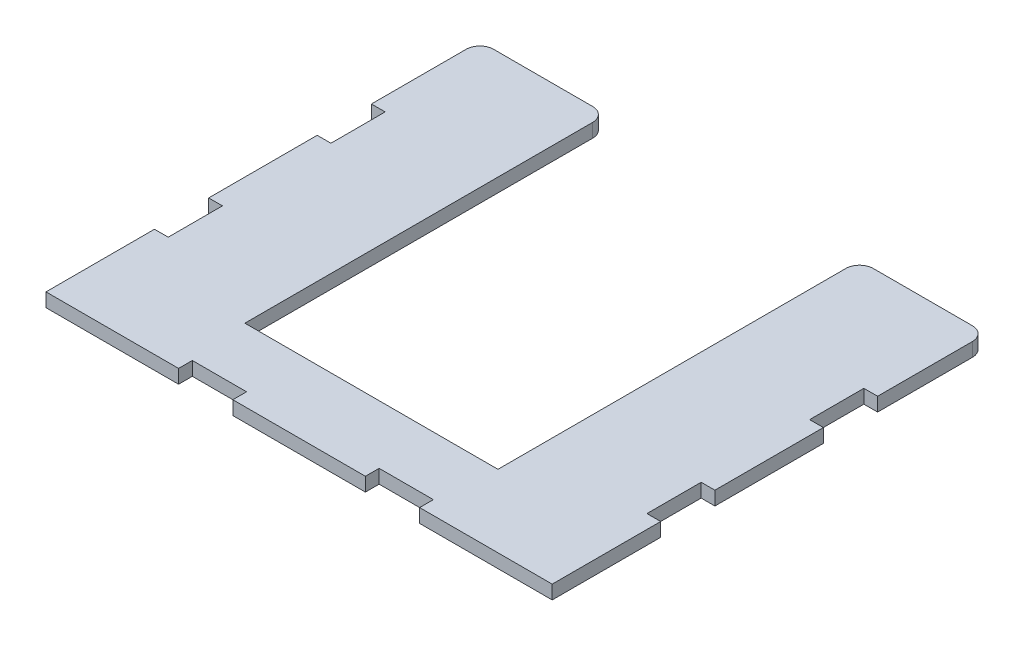
ISO-10303-21;
HEADER;
FILE_DESCRIPTION(('STEP AP214'),'2;1');
FILE_NAME('part.step','',(''),(''),'','','');
FILE_SCHEMA(('AUTOMOTIVE_DESIGN { 1 0 10303 214 1 1 1 1 }'));
ENDSEC;
DATA;
#1=APPLICATION_CONTEXT('core data for automotive mechanical design processes');
#2=APPLICATION_PROTOCOL_DEFINITION('international standard','automotive_design',2000,#1);
#3=PRODUCT_CONTEXT('',#1,'mechanical');
#4=PRODUCT('Part','Part','',(#3));
#5=PRODUCT_RELATED_PRODUCT_CATEGORY('part','',(#4));
#6=PRODUCT_DEFINITION_FORMATION('','',#4);
#7=PRODUCT_DEFINITION_CONTEXT('part definition',#1,'design');
#8=PRODUCT_DEFINITION('design','',#6,#7);
#9=PRODUCT_DEFINITION_SHAPE('','',#8);
#10=(LENGTH_UNIT() NAMED_UNIT(*) SI_UNIT(.MILLI.,.METRE.));
#11=(NAMED_UNIT(*) PLANE_ANGLE_UNIT() SI_UNIT($,.RADIAN.));
#12=(NAMED_UNIT(*) SI_UNIT($,.STERADIAN.) SOLID_ANGLE_UNIT());
#13=UNCERTAINTY_MEASURE_WITH_UNIT(LENGTH_MEASURE(1.E-05),#10,'distance_accuracy_value','');
#14=(GEOMETRIC_REPRESENTATION_CONTEXT(3) GLOBAL_UNCERTAINTY_ASSIGNED_CONTEXT((#13)) GLOBAL_UNIT_ASSIGNED_CONTEXT((#10,
#11,#12)) REPRESENTATION_CONTEXT('',''));
#15=CARTESIAN_POINT('',(0.,0.,0.));
#16=DIRECTION('',(0.,0.,1.));
#17=DIRECTION('',(1.,0.,0.));
#18=AXIS2_PLACEMENT_3D('',#15,#16,#17);
#19=CARTESIAN_POINT('',(177.8,4.826,0.));
#20=DIRECTION('',(-1.,0.,0.));
#21=DIRECTION('',(0.,0.,1.));
#22=AXIS2_PLACEMENT_3D('',#19,#20,#21);
#23=PLANE('',#22);
#24=DIRECTION('',(0.,0.,-1.));
#25=VECTOR('',#24,1.);
#26=CARTESIAN_POINT('',(177.8,0.,0.));
#27=LINE('',#26,#25);
#28=CARTESIAN_POINT('',(177.8,0.,0.));
#29=VERTEX_POINT('',#28);
#30=CARTESIAN_POINT('',(177.8,0.,-38.1));
#31=VERTEX_POINT('',#30);
#32=EDGE_CURVE('E296',#29,#31,#27,.T.);
#33=ORIENTED_EDGE('',*,*,#32,.T.);
#34=DIRECTION('',(0.,1.,0.));
#35=VECTOR('',#34,1.);
#36=CARTESIAN_POINT('',(177.8,0.,-38.1));
#37=LINE('',#36,#35);
#38=CARTESIAN_POINT('',(177.8,4.826,-38.1));
#39=VERTEX_POINT('',#38);
#40=EDGE_CURVE('E918',#31,#39,#37,.T.);
#41=ORIENTED_EDGE('',*,*,#40,.T.);
#42=DIRECTION('',(0.,0.,-1.));
#43=VECTOR('',#42,1.);
#44=CARTESIAN_POINT('',(177.8,4.826,0.));
#45=LINE('',#44,#43);
#46=CARTESIAN_POINT('',(177.8,4.826,0.));
#47=VERTEX_POINT('',#46);
#48=EDGE_CURVE('E385',#47,#39,#45,.T.);
#49=ORIENTED_EDGE('',*,*,#48,.F.);
#50=DIRECTION('',(0.,-1.,0.));
#51=VECTOR('',#50,1.);
#52=CARTESIAN_POINT('',(177.8,4.826,0.));
#53=LINE('',#52,#51);
#54=EDGE_CURVE('E310',#47,#29,#53,.T.);
#55=ORIENTED_EDGE('',*,*,#54,.T.);
#56=EDGE_LOOP('',(#33,#41,#49,#55));
#57=FACE_BOUND('',#56,.T.);
#58=ADVANCED_FACE('F34',(#57),#23,.F.);
#59=CARTESIAN_POINT('',(177.8,4.826,-57.15));
#60=VERTEX_POINT('',#59);
#61=CARTESIAN_POINT('',(177.8,4.826,-95.25));
#62=VERTEX_POINT('',#61);
#63=EDGE_CURVE('E287',#60,#62,#45,.T.);
#64=ORIENTED_EDGE('',*,*,#63,.F.);
#65=DIRECTION('',(0.,1.,0.));
#66=VECTOR('',#65,1.);
#67=CARTESIAN_POINT('',(177.8,0.,-57.15));
#68=LINE('',#67,#66);
#69=CARTESIAN_POINT('',(177.8,0.,-57.15));
#70=VERTEX_POINT('',#69);
#71=EDGE_CURVE('E272',#70,#60,#68,.T.);
#72=ORIENTED_EDGE('',*,*,#71,.F.);
#73=CARTESIAN_POINT('',(177.8,0.,-95.25));
#74=VERTEX_POINT('',#73);
#75=EDGE_CURVE('E285',#70,#74,#27,.T.);
#76=ORIENTED_EDGE('',*,*,#75,.T.);
#77=DIRECTION('',(0.,1.,0.));
#78=VECTOR('',#77,1.);
#79=CARTESIAN_POINT('',(177.8,0.,-95.25));
#80=LINE('',#79,#78);
#81=EDGE_CURVE('E562',#74,#62,#80,.T.);
#82=ORIENTED_EDGE('',*,*,#81,.T.);
#83=EDGE_LOOP('',(#64,#72,#76,#82));
#84=FACE_BOUND('',#83,.T.);
#85=ADVANCED_FACE('F283',(#84),#23,.F.);
#86=CARTESIAN_POINT('',(0.,4.826,0.));
#87=DIRECTION('',(1.,0.,0.));
#88=DIRECTION('',(0.,0.,-1.));
#89=AXIS2_PLACEMENT_3D('',#86,#87,#88);
#90=PLANE('',#89);
#91=DIRECTION('',(0.,0.,1.));
#92=VECTOR('',#91,1.);
#93=CARTESIAN_POINT('',(0.,0.,0.));
#94=LINE('',#93,#92);
#95=CARTESIAN_POINT('',(0.,0.,-95.25));
#96=VERTEX_POINT('',#95);
#97=CARTESIAN_POINT('',(0.,0.,-57.15));
#98=VERTEX_POINT('',#97);
#99=EDGE_CURVE('E391',#96,#98,#94,.T.);
#100=ORIENTED_EDGE('',*,*,#99,.T.);
#101=DIRECTION('',(0.,1.,0.));
#102=VECTOR('',#101,1.);
#103=CARTESIAN_POINT('',(0.,0.,-57.15));
#104=LINE('',#103,#102);
#105=CARTESIAN_POINT('',(0.,4.826,-57.15));
#106=VERTEX_POINT('',#105);
#107=EDGE_CURVE('E437',#98,#106,#104,.T.);
#108=ORIENTED_EDGE('',*,*,#107,.T.);
#109=DIRECTION('',(0.,0.,1.));
#110=VECTOR('',#109,1.);
#111=CARTESIAN_POINT('',(0.,4.826,0.));
#112=LINE('',#111,#110);
#113=CARTESIAN_POINT('',(0.,4.826,-95.25));
#114=VERTEX_POINT('',#113);
#115=EDGE_CURVE('E379',#114,#106,#112,.T.);
#116=ORIENTED_EDGE('',*,*,#115,.F.);
#117=DIRECTION('',(0.,1.,0.));
#118=VECTOR('',#117,1.);
#119=CARTESIAN_POINT('',(0.,0.,-95.25));
#120=LINE('',#119,#118);
#121=EDGE_CURVE('E435',#96,#114,#120,.T.);
#122=ORIENTED_EDGE('',*,*,#121,.F.);
#123=EDGE_LOOP('',(#100,#108,#116,#122));
#124=FACE_BOUND('',#123,.T.);
#125=ADVANCED_FACE('F434',(#124),#90,.F.);
#126=CARTESIAN_POINT('',(0.,4.826,-147.574));
#127=VERTEX_POINT('',#126);
#128=CARTESIAN_POINT('',(0.,4.826,-114.3));
#129=VERTEX_POINT('',#128);
#130=EDGE_CURVE('E376',#127,#129,#112,.T.);
#131=ORIENTED_EDGE('',*,*,#130,.F.);
#132=DIRECTION('',(0.,-1.,0.));
#133=VECTOR('',#132,1.);
#134=CARTESIAN_POINT('',(0.,4.826,-147.574));
#135=LINE('',#134,#133);
#136=CARTESIAN_POINT('',(0.,0.,-147.574));
#137=VERTEX_POINT('',#136);
#138=EDGE_CURVE('E317',#127,#137,#135,.T.);
#139=ORIENTED_EDGE('',*,*,#138,.T.);
#140=CARTESIAN_POINT('',(0.,0.,-114.3));
#141=VERTEX_POINT('',#140);
#142=EDGE_CURVE('E389',#137,#141,#94,.T.);
#143=ORIENTED_EDGE('',*,*,#142,.T.);
#144=DIRECTION('',(0.,1.,0.));
#145=VECTOR('',#144,1.);
#146=CARTESIAN_POINT('',(0.,0.,-114.3));
#147=LINE('',#146,#145);
#148=EDGE_CURVE('E467',#141,#129,#147,.T.);
#149=ORIENTED_EDGE('',*,*,#148,.T.);
#150=EDGE_LOOP('',(#131,#139,#143,#149));
#151=FACE_BOUND('',#150,.T.);
#152=ADVANCED_FACE('F603',(#151),#90,.F.);
#153=CARTESIAN_POINT('',(0.,4.826,0.));
#154=DIRECTION('',(0.,0.,-1.));
#155=DIRECTION('',(-1.,0.,0.));
#156=AXIS2_PLACEMENT_3D('',#153,#154,#155);
#157=PLANE('',#156);
#158=DIRECTION('',(1.,0.,0.));
#159=VECTOR('',#158,1.);
#160=CARTESIAN_POINT('',(0.,0.,0.));
#161=LINE('',#160,#159);
#162=CARTESIAN_POINT('',(65.6166666666667,0.,0.));
#163=VERTEX_POINT('',#162);
#164=CARTESIAN_POINT('',(112.183333333333,0.,0.));
#165=VERTEX_POINT('',#164);
#166=EDGE_CURVE('E395',#163,#165,#161,.T.);
#167=ORIENTED_EDGE('',*,*,#166,.T.);
#168=DIRECTION('',(0.,1.,0.));
#169=VECTOR('',#168,1.);
#170=CARTESIAN_POINT('',(112.183333333333,0.,0.));
#171=LINE('',#170,#169);
#172=CARTESIAN_POINT('',(112.183333333333,4.826,0.));
#173=VERTEX_POINT('',#172);
#174=EDGE_CURVE('E485',#165,#173,#171,.T.);
#175=ORIENTED_EDGE('',*,*,#174,.T.);
#176=DIRECTION('',(1.,0.,0.));
#177=VECTOR('',#176,1.);
#178=CARTESIAN_POINT('',(0.,4.826,0.));
#179=LINE('',#178,#177);
#180=CARTESIAN_POINT('',(65.6166666666667,4.826,0.));
#181=VERTEX_POINT('',#180);
#182=EDGE_CURVE('E384',#181,#173,#179,.T.);
#183=ORIENTED_EDGE('',*,*,#182,.F.);
#184=DIRECTION('',(0.,1.,0.));
#185=VECTOR('',#184,1.);
#186=CARTESIAN_POINT('',(65.6166666666667,0.,0.));
#187=LINE('',#186,#185);
#188=EDGE_CURVE('E514',#163,#181,#187,.T.);
#189=ORIENTED_EDGE('',*,*,#188,.F.);
#190=EDGE_LOOP('',(#167,#175,#183,#189));
#191=FACE_BOUND('',#190,.T.);
#192=ADVANCED_FACE('F598',(#191),#157,.F.);
#193=CARTESIAN_POINT('',(0.,0.,0.));
#194=VERTEX_POINT('',#193);
#195=CARTESIAN_POINT('',(46.5666666666667,0.,0.));
#196=VERTEX_POINT('',#195);
#197=EDGE_CURVE('E302',#194,#196,#161,.T.);
#198=ORIENTED_EDGE('',*,*,#197,.T.);
#199=DIRECTION('',(0.,1.,0.));
#200=VECTOR('',#199,1.);
#201=CARTESIAN_POINT('',(46.5666666666667,0.,0.));
#202=LINE('',#201,#200);
#203=CARTESIAN_POINT('',(46.5666666666667,4.826,0.));
#204=VERTEX_POINT('',#203);
#205=EDGE_CURVE('E415',#196,#204,#202,.T.);
#206=ORIENTED_EDGE('',*,*,#205,.T.);
#207=CARTESIAN_POINT('',(0.,4.826,0.));
#208=VERTEX_POINT('',#207);
#209=EDGE_CURVE('E380',#208,#204,#179,.T.);
#210=ORIENTED_EDGE('',*,*,#209,.F.);
#211=DIRECTION('',(0.,-1.,0.));
#212=VECTOR('',#211,1.);
#213=CARTESIAN_POINT('',(0.,4.826,0.));
#214=LINE('',#213,#212);
#215=EDGE_CURVE('E313',#208,#194,#214,.T.);
#216=ORIENTED_EDGE('',*,*,#215,.T.);
#217=EDGE_LOOP('',(#198,#206,#210,#216));
#218=FACE_BOUND('',#217,.T.);
#219=ADVANCED_FACE('F414',(#218),#157,.F.);
#220=CARTESIAN_POINT('',(0.,4.826,-152.4));
#221=DIRECTION('',(0.,0.,1.));
#222=DIRECTION('',(1.,0.,0.));
#223=AXIS2_PLACEMENT_3D('',#220,#221,#222);
#224=PLANE('',#223);
#225=DIRECTION('',(-1.,0.,0.));
#226=VECTOR('',#225,1.);
#227=CARTESIAN_POINT('',(0.,0.,-152.4));
#228=LINE('',#227,#226);
#229=CARTESIAN_POINT('',(39.624,0.,-152.4));
#230=VERTEX_POINT('',#229);
#231=CARTESIAN_POINT('',(4.826,0.,-152.4));
#232=VERTEX_POINT('',#231);
#233=EDGE_CURVE('E300',#230,#232,#228,.T.);
#234=ORIENTED_EDGE('',*,*,#233,.T.);
#235=DIRECTION('',(0.,-1.,0.));
#236=VECTOR('',#235,1.);
#237=CARTESIAN_POINT('',(4.826,4.826,-152.4));
#238=LINE('',#237,#236);
#239=CARTESIAN_POINT('',(4.826,4.826,-152.4));
#240=VERTEX_POINT('',#239);
#241=EDGE_CURVE('E330',#232,#240,#238,.F.);
#242=ORIENTED_EDGE('',*,*,#241,.T.);
#243=DIRECTION('',(-1.,0.,0.));
#244=VECTOR('',#243,1.);
#245=CARTESIAN_POINT('',(0.,4.826,-152.4));
#246=LINE('',#245,#244);
#247=CARTESIAN_POINT('',(39.624,4.826,-152.4));
#248=VERTEX_POINT('',#247);
#249=EDGE_CURVE('E388',#248,#240,#246,.T.);
#250=ORIENTED_EDGE('',*,*,#249,.F.);
#251=DIRECTION('',(0.,1.,0.));
#252=VECTOR('',#251,1.);
#253=CARTESIAN_POINT('',(39.624,4.826,-152.4));
#254=LINE('',#253,#252);
#255=EDGE_CURVE('E328',#248,#230,#254,.F.);
#256=ORIENTED_EDGE('',*,*,#255,.T.);
#257=EDGE_LOOP('',(#234,#242,#250,#256));
#258=FACE_BOUND('',#257,.T.);
#259=ADVANCED_FACE('F596',(#258),#224,.F.);
#260=CARTESIAN_POINT('',(0.,4.826,-38.1));
#261=VERTEX_POINT('',#260);
#262=EDGE_CURVE('E309',#261,#208,#112,.T.);
#263=ORIENTED_EDGE('',*,*,#262,.F.);
#264=DIRECTION('',(0.,1.,0.));
#265=VECTOR('',#264,1.);
#266=CARTESIAN_POINT('',(0.,0.,-38.1));
#267=LINE('',#266,#265);
#268=CARTESIAN_POINT('',(0.,0.,-38.1));
#269=VERTEX_POINT('',#268);
#270=EDGE_CURVE('E404',#269,#261,#267,.T.);
#271=ORIENTED_EDGE('',*,*,#270,.F.);
#272=EDGE_CURVE('E373',#269,#194,#94,.T.);
#273=ORIENTED_EDGE('',*,*,#272,.T.);
#274=ORIENTED_EDGE('',*,*,#215,.F.);
#275=EDGE_LOOP('',(#263,#271,#273,#274));
#276=FACE_BOUND('',#275,.T.);
#277=ADVANCED_FACE('F403',(#276),#90,.F.);
#278=CARTESIAN_POINT('',(131.233333333333,4.826,0.));
#279=VERTEX_POINT('',#278);
#280=EDGE_CURVE('E378',#279,#47,#179,.T.);
#281=ORIENTED_EDGE('',*,*,#280,.F.);
#282=DIRECTION('',(0.,1.,0.));
#283=VECTOR('',#282,1.);
#284=CARTESIAN_POINT('',(131.233333333333,0.,0.));
#285=LINE('',#284,#283);
#286=CARTESIAN_POINT('',(131.233333333333,0.,0.));
#287=VERTEX_POINT('',#286);
#288=EDGE_CURVE('E496',#287,#279,#285,.T.);
#289=ORIENTED_EDGE('',*,*,#288,.F.);
#290=EDGE_CURVE('E390',#287,#29,#161,.T.);
#291=ORIENTED_EDGE('',*,*,#290,.T.);
#292=ORIENTED_EDGE('',*,*,#54,.F.);
#293=EDGE_LOOP('',(#281,#289,#291,#292));
#294=FACE_BOUND('',#293,.T.);
#295=ADVANCED_FACE('F591',(#294),#157,.F.);
#296=CARTESIAN_POINT('',(177.8,0.,-114.3));
#297=VERTEX_POINT('',#296);
#298=CARTESIAN_POINT('',(177.8,0.,-147.574));
#299=VERTEX_POINT('',#298);
#300=EDGE_CURVE('E297',#297,#299,#27,.T.);
#301=ORIENTED_EDGE('',*,*,#300,.T.);
#302=DIRECTION('',(0.,-1.,0.));
#303=VECTOR('',#302,1.);
#304=CARTESIAN_POINT('',(177.8,4.826,-147.574));
#305=LINE('',#304,#303);
#306=CARTESIAN_POINT('',(177.8,4.826,-147.574));
#307=VERTEX_POINT('',#306);
#308=EDGE_CURVE('E344',#299,#307,#305,.F.);
#309=ORIENTED_EDGE('',*,*,#308,.T.);
#310=CARTESIAN_POINT('',(177.8,4.826,-114.3));
#311=VERTEX_POINT('',#310);
#312=EDGE_CURVE('E383',#311,#307,#45,.T.);
#313=ORIENTED_EDGE('',*,*,#312,.F.);
#314=DIRECTION('',(0.,1.,0.));
#315=VECTOR('',#314,1.);
#316=CARTESIAN_POINT('',(177.8,0.,-114.3));
#317=LINE('',#316,#315);
#318=EDGE_CURVE('E544',#297,#311,#317,.T.);
#319=ORIENTED_EDGE('',*,*,#318,.F.);
#320=EDGE_LOOP('',(#301,#309,#313,#319));
#321=FACE_BOUND('',#320,.T.);
#322=ADVANCED_FACE('F543',(#321),#23,.F.);
#323=CARTESIAN_POINT('',(172.974,4.826,-152.4));
#324=VERTEX_POINT('',#323);
#325=CARTESIAN_POINT('',(138.176,4.826,-152.4));
#326=VERTEX_POINT('',#325);
#327=EDGE_CURVE('E314',#324,#326,#246,.T.);
#328=ORIENTED_EDGE('',*,*,#327,.F.);
#329=DIRECTION('',(0.,-1.,0.));
#330=VECTOR('',#329,1.);
#331=CARTESIAN_POINT('',(172.974,4.826,-152.4));
#332=LINE('',#331,#330);
#333=CARTESIAN_POINT('',(172.974,0.,-152.4));
#334=VERTEX_POINT('',#333);
#335=EDGE_CURVE('E341',#324,#334,#332,.T.);
#336=ORIENTED_EDGE('',*,*,#335,.T.);
#337=CARTESIAN_POINT('',(138.176,0.,-152.4));
#338=VERTEX_POINT('',#337);
#339=EDGE_CURVE('E306',#334,#338,#228,.T.);
#340=ORIENTED_EDGE('',*,*,#339,.T.);
#341=DIRECTION('',(0.,1.,0.));
#342=VECTOR('',#341,1.);
#343=CARTESIAN_POINT('',(138.176,4.826,-152.4));
#344=LINE('',#343,#342);
#345=EDGE_CURVE('E338',#338,#326,#344,.T.);
#346=ORIENTED_EDGE('',*,*,#345,.T.);
#347=EDGE_LOOP('',(#328,#336,#340,#346));
#348=FACE_BOUND('',#347,.T.);
#349=ADVANCED_FACE('F530',(#348),#224,.F.);
#350=CARTESIAN_POINT('',(0.,4.826,0.));
#351=DIRECTION('',(0.,-1.,0.));
#352=DIRECTION('',(0.,0.,-1.));
#353=AXIS2_PLACEMENT_3D('',#350,#351,#352);
#354=PLANE('',#353);
#355=ORIENTED_EDGE('',*,*,#249,.T.);
#356=CARTESIAN_POINT('',(4.826,4.826,-147.574));
#357=DIRECTION('',(0.,-1.,0.));
#358=DIRECTION('',(0.,0.,-1.));
#359=AXIS2_PLACEMENT_3D('',#356,#357,#358);
#360=CIRCLE('',#359,4.826);
#361=EDGE_CURVE('E336',#240,#127,#360,.F.);
#362=ORIENTED_EDGE('',*,*,#361,.T.);
#363=ORIENTED_EDGE('',*,*,#130,.T.);
#364=DIRECTION('',(-1.,0.,0.));
#365=VECTOR('',#364,1.);
#366=CARTESIAN_POINT('',(0.,4.826,-114.3));
#367=LINE('',#366,#365);
#368=CARTESIAN_POINT('',(4.826,4.826,-114.3));
#369=VERTEX_POINT('',#368);
#370=EDGE_CURVE('E457',#369,#129,#367,.T.);
#371=ORIENTED_EDGE('',*,*,#370,.F.);
#372=DIRECTION('',(0.,0.,-1.));
#373=VECTOR('',#372,1.);
#374=CARTESIAN_POINT('',(4.826,4.826,-114.3));
#375=LINE('',#374,#373);
#376=CARTESIAN_POINT('',(4.826,4.826,-95.25));
#377=VERTEX_POINT('',#376);
#378=EDGE_CURVE('E443',#377,#369,#375,.T.);
#379=ORIENTED_EDGE('',*,*,#378,.F.);
#380=DIRECTION('',(1.,0.,0.));
#381=VECTOR('',#380,1.);
#382=CARTESIAN_POINT('',(0.,4.826,-95.25));
#383=LINE('',#382,#381);
#384=EDGE_CURVE('E430',#114,#377,#383,.T.);
#385=ORIENTED_EDGE('',*,*,#384,.F.);
#386=ORIENTED_EDGE('',*,*,#115,.T.);
#387=DIRECTION('',(-1.,0.,0.));
#388=VECTOR('',#387,1.);
#389=CARTESIAN_POINT('',(0.,4.826,-57.15));
#390=LINE('',#389,#388);
#391=CARTESIAN_POINT('',(4.826,4.826,-57.15));
#392=VERTEX_POINT('',#391);
#393=EDGE_CURVE('E427',#392,#106,#390,.T.);
#394=ORIENTED_EDGE('',*,*,#393,.F.);
#395=DIRECTION('',(0.,0.,-1.));
#396=VECTOR('',#395,1.);
#397=CARTESIAN_POINT('',(4.826,4.826,-57.15));
#398=LINE('',#397,#396);
#399=CARTESIAN_POINT('',(4.826,4.826,-38.1));
#400=VERTEX_POINT('',#399);
#401=EDGE_CURVE('E561',#400,#392,#398,.T.);
#402=ORIENTED_EDGE('',*,*,#401,.F.);
#403=DIRECTION('',(1.,0.,0.));
#404=VECTOR('',#403,1.);
#405=CARTESIAN_POINT('',(0.,4.826,-38.1));
#406=LINE('',#405,#404);
#407=EDGE_CURVE('E422',#261,#400,#406,.T.);
#408=ORIENTED_EDGE('',*,*,#407,.F.);
#409=ORIENTED_EDGE('',*,*,#262,.T.);
#410=ORIENTED_EDGE('',*,*,#209,.T.);
#411=DIRECTION('',(0.,0.,1.));
#412=VECTOR('',#411,1.);
#413=CARTESIAN_POINT('',(46.5666666666667,4.826,0.));
#414=LINE('',#413,#412);
#415=CARTESIAN_POINT('',(46.5666666666667,4.826,-4.826));
#416=VERTEX_POINT('',#415);
#417=EDGE_CURVE('E418',#416,#204,#414,.T.);
#418=ORIENTED_EDGE('',*,*,#417,.F.);
#419=DIRECTION('',(-1.,0.,0.));
#420=VECTOR('',#419,1.);
#421=CARTESIAN_POINT('',(46.5666666666667,4.826,-4.826));
#422=LINE('',#421,#420);
#423=CARTESIAN_POINT('',(65.6166666666667,4.826,-4.826));
#424=VERTEX_POINT('',#423);
#425=EDGE_CURVE('E502',#424,#416,#422,.T.);
#426=ORIENTED_EDGE('',*,*,#425,.F.);
#427=DIRECTION('',(0.,0.,-1.));
#428=VECTOR('',#427,1.);
#429=CARTESIAN_POINT('',(65.6166666666667,4.826,0.));
#430=LINE('',#429,#428);
#431=EDGE_CURVE('E508',#181,#424,#430,.T.);
#432=ORIENTED_EDGE('',*,*,#431,.F.);
#433=ORIENTED_EDGE('',*,*,#182,.T.);
#434=DIRECTION('',(0.,0.,1.));
#435=VECTOR('',#434,1.);
#436=CARTESIAN_POINT('',(112.183333333333,4.826,0.));
#437=LINE('',#436,#435);
#438=CARTESIAN_POINT('',(112.183333333333,4.826,-4.826));
#439=VERTEX_POINT('',#438);
#440=EDGE_CURVE('E469',#439,#173,#437,.T.);
#441=ORIENTED_EDGE('',*,*,#440,.F.);
#442=DIRECTION('',(-1.,0.,0.));
#443=VECTOR('',#442,1.);
#444=CARTESIAN_POINT('',(112.183333333333,4.826,-4.826));
#445=LINE('',#444,#443);
#446=CARTESIAN_POINT('',(131.233333333333,4.826,-4.826));
#447=VERTEX_POINT('',#446);
#448=EDGE_CURVE('E479',#447,#439,#445,.T.);
#449=ORIENTED_EDGE('',*,*,#448,.F.);
#450=DIRECTION('',(0.,0.,-1.));
#451=VECTOR('',#450,1.);
#452=CARTESIAN_POINT('',(131.233333333333,4.826,0.));
#453=LINE('',#452,#451);
#454=EDGE_CURVE('E487',#279,#447,#453,.T.);
#455=ORIENTED_EDGE('',*,*,#454,.F.);
#456=ORIENTED_EDGE('',*,*,#280,.T.);
#457=ORIENTED_EDGE('',*,*,#48,.T.);
#458=DIRECTION('',(1.,0.,0.));
#459=VECTOR('',#458,1.);
#460=CARTESIAN_POINT('',(177.8,4.826,-38.1));
#461=LINE('',#460,#459);
#462=CARTESIAN_POINT('',(172.974,4.826,-38.1));
#463=VERTEX_POINT('',#462);
#464=EDGE_CURVE('E279',#463,#39,#461,.T.);
#465=ORIENTED_EDGE('',*,*,#464,.F.);
#466=DIRECTION('',(0.,0.,1.));
#467=VECTOR('',#466,1.);
#468=CARTESIAN_POINT('',(172.974,4.826,-57.15));
#469=LINE('',#468,#467);
#470=CARTESIAN_POINT('',(172.974,4.826,-57.15));
#471=VERTEX_POINT('',#470);
#472=EDGE_CURVE('E923',#471,#463,#469,.T.);
#473=ORIENTED_EDGE('',*,*,#472,.F.);
#474=DIRECTION('',(-1.,0.,0.));
#475=VECTOR('',#474,1.);
#476=CARTESIAN_POINT('',(177.8,4.826,-57.15));
#477=LINE('',#476,#475);
#478=EDGE_CURVE('E937',#60,#471,#477,.T.);
#479=ORIENTED_EDGE('',*,*,#478,.F.);
#480=ORIENTED_EDGE('',*,*,#63,.T.);
#481=DIRECTION('',(1.,0.,0.));
#482=VECTOR('',#481,1.);
#483=CARTESIAN_POINT('',(177.8,4.826,-95.25));
#484=LINE('',#483,#482);
#485=CARTESIAN_POINT('',(172.974,4.826,-95.25));
#486=VERTEX_POINT('',#485);
#487=EDGE_CURVE('E944',#486,#62,#484,.T.);
#488=ORIENTED_EDGE('',*,*,#487,.F.);
#489=DIRECTION('',(0.,0.,1.));
#490=VECTOR('',#489,1.);
#491=CARTESIAN_POINT('',(172.974,4.826,-114.3));
#492=LINE('',#491,#490);
#493=CARTESIAN_POINT('',(172.974,4.826,-114.3));
#494=VERTEX_POINT('',#493);
#495=EDGE_CURVE('E947',#494,#486,#492,.T.);
#496=ORIENTED_EDGE('',*,*,#495,.F.);
#497=DIRECTION('',(-1.,0.,0.));
#498=VECTOR('',#497,1.);
#499=CARTESIAN_POINT('',(177.8,4.826,-114.3));
#500=LINE('',#499,#498);
#501=EDGE_CURVE('E927',#311,#494,#500,.T.);
#502=ORIENTED_EDGE('',*,*,#501,.F.);
#503=ORIENTED_EDGE('',*,*,#312,.T.);
#504=CARTESIAN_POINT('',(172.974,4.826,-147.574));
#505=DIRECTION('',(0.,-1.,0.));
#506=DIRECTION('',(0.,0.,-1.));
#507=AXIS2_PLACEMENT_3D('',#504,#505,#506);
#508=CIRCLE('',#507,4.826);
#509=EDGE_CURVE('E334',#307,#324,#508,.F.);
#510=ORIENTED_EDGE('',*,*,#509,.T.);
#511=ORIENTED_EDGE('',*,*,#327,.T.);
#512=CARTESIAN_POINT('',(138.176,4.826,-147.574));
#513=DIRECTION('',(0.,-1.,0.));
#514=DIRECTION('',(0.,0.,-1.));
#515=AXIS2_PLACEMENT_3D('',#512,#513,#514);
#516=CIRCLE('',#515,4.826);
#517=CARTESIAN_POINT('',(133.35,4.826,-147.574));
#518=VERTEX_POINT('',#517);
#519=EDGE_CURVE('E57',#326,#518,#516,.F.);
#520=ORIENTED_EDGE('',*,*,#519,.T.);
#521=DIRECTION('',(0.,0.,-1.));
#522=VECTOR('',#521,1.);
#523=CARTESIAN_POINT('',(133.35,4.826,-152.4));
#524=LINE('',#523,#522);
#525=CARTESIAN_POINT('',(133.35,4.826,-25.4));
#526=VERTEX_POINT('',#525);
#527=EDGE_CURVE('E362',#526,#518,#524,.T.);
#528=ORIENTED_EDGE('',*,*,#527,.F.);
#529=DIRECTION('',(1.,0.,0.));
#530=VECTOR('',#529,1.);
#531=CARTESIAN_POINT('',(44.45,4.826,-25.4));
#532=LINE('',#531,#530);
#533=CARTESIAN_POINT('',(44.45,4.826,-25.4));
#534=VERTEX_POINT('',#533);
#535=EDGE_CURVE('E359',#534,#526,#532,.T.);
#536=ORIENTED_EDGE('',*,*,#535,.F.);
#537=DIRECTION('',(0.,0.,1.));
#538=VECTOR('',#537,1.);
#539=CARTESIAN_POINT('',(44.45,4.826,-152.4));
#540=LINE('',#539,#538);
#541=CARTESIAN_POINT('',(44.45,4.826,-147.574));
#542=VERTEX_POINT('',#541);
#543=EDGE_CURVE('E350',#542,#534,#540,.T.);
#544=ORIENTED_EDGE('',*,*,#543,.F.);
#545=CARTESIAN_POINT('',(39.624,4.826,-147.574));
#546=DIRECTION('',(0.,-1.,0.));
#547=DIRECTION('',(0.,0.,-1.));
#548=AXIS2_PLACEMENT_3D('',#545,#546,#547);
#549=CIRCLE('',#548,4.826);
#550=EDGE_CURVE('E49',#542,#248,#549,.F.);
#551=ORIENTED_EDGE('',*,*,#550,.T.);
#552=EDGE_LOOP('',(#355,#362,#363,#371,#379,#385,#386,#394,#402,#408,#409,#410,#418,#426,#432,
#433,#441,#449,#455,#456,#457,#465,#473,#479,#480,#488,#496,#502,#503,#510,#511,#520,#528,#536,
#544,#551));
#553=FACE_BOUND('',#552,.T.);
#554=ADVANCED_FACE('F356',(#553),#354,.F.);
#555=CARTESIAN_POINT('',(0.,0.,0.));
#556=DIRECTION('',(0.,-1.,0.));
#557=DIRECTION('',(0.,0.,-1.));
#558=AXIS2_PLACEMENT_3D('',#555,#556,#557);
#559=PLANE('',#558);
#560=ORIENTED_EDGE('',*,*,#142,.F.);
#561=CARTESIAN_POINT('',(4.826,0.,-147.574));
#562=DIRECTION('',(0.,-1.,0.));
#563=DIRECTION('',(0.,0.,-1.));
#564=AXIS2_PLACEMENT_3D('',#561,#562,#563);
#565=CIRCLE('',#564,4.826);
#566=EDGE_CURVE('E326',#137,#232,#565,.T.);
#567=ORIENTED_EDGE('',*,*,#566,.T.);
#568=ORIENTED_EDGE('',*,*,#233,.F.);
#569=CARTESIAN_POINT('',(39.624,0.,-147.574));
#570=DIRECTION('',(0.,-1.,0.));
#571=DIRECTION('',(0.,0.,-1.));
#572=AXIS2_PLACEMENT_3D('',#569,#570,#571);
#573=CIRCLE('',#572,4.826);
#574=CARTESIAN_POINT('',(44.45,0.,-147.574));
#575=VERTEX_POINT('',#574);
#576=EDGE_CURVE('E322',#230,#575,#573,.T.);
#577=ORIENTED_EDGE('',*,*,#576,.T.);
#578=DIRECTION('',(0.,0.,1.));
#579=VECTOR('',#578,1.);
#580=CARTESIAN_POINT('',(44.45,0.,-152.4));
#581=LINE('',#580,#579);
#582=CARTESIAN_POINT('',(44.45,0.,-25.4));
#583=VERTEX_POINT('',#582);
#584=EDGE_CURVE('E352',#575,#583,#581,.T.);
#585=ORIENTED_EDGE('',*,*,#584,.T.);
#586=DIRECTION('',(1.,0.,0.));
#587=VECTOR('',#586,1.);
#588=CARTESIAN_POINT('',(44.45,0.,-25.4));
#589=LINE('',#588,#587);
#590=CARTESIAN_POINT('',(133.35,0.,-25.4));
#591=VERTEX_POINT('',#590);
#592=EDGE_CURVE('E517',#583,#591,#589,.T.);
#593=ORIENTED_EDGE('',*,*,#592,.T.);
#594=DIRECTION('',(0.,0.,-1.));
#595=VECTOR('',#594,1.);
#596=CARTESIAN_POINT('',(133.35,0.,-152.4));
#597=LINE('',#596,#595);
#598=CARTESIAN_POINT('',(133.35,0.,-147.574));
#599=VERTEX_POINT('',#598);
#600=EDGE_CURVE('E367',#591,#599,#597,.T.);
#601=ORIENTED_EDGE('',*,*,#600,.T.);
#602=CARTESIAN_POINT('',(138.176,0.,-147.574));
#603=DIRECTION('',(0.,-1.,0.));
#604=DIRECTION('',(0.,0.,-1.));
#605=AXIS2_PLACEMENT_3D('',#602,#603,#604);
#606=CIRCLE('',#605,4.826);
#607=EDGE_CURVE('E320',#599,#338,#606,.T.);
#608=ORIENTED_EDGE('',*,*,#607,.T.);
#609=ORIENTED_EDGE('',*,*,#339,.F.);
#610=CARTESIAN_POINT('',(172.974,0.,-147.574));
#611=DIRECTION('',(0.,-1.,0.));
#612=DIRECTION('',(0.,0.,-1.));
#613=AXIS2_PLACEMENT_3D('',#610,#611,#612);
#614=CIRCLE('',#613,4.826);
#615=EDGE_CURVE('E324',#334,#299,#614,.T.);
#616=ORIENTED_EDGE('',*,*,#615,.T.);
#617=ORIENTED_EDGE('',*,*,#300,.F.);
#618=DIRECTION('',(-1.,0.,0.));
#619=VECTOR('',#618,1.);
#620=CARTESIAN_POINT('',(177.8,0.,-114.3));
#621=LINE('',#620,#619);
#622=CARTESIAN_POINT('',(172.974,0.,-114.3));
#623=VERTEX_POINT('',#622);
#624=EDGE_CURVE('E942',#297,#623,#621,.T.);
#625=ORIENTED_EDGE('',*,*,#624,.T.);
#626=DIRECTION('',(0.,0.,1.));
#627=VECTOR('',#626,1.);
#628=CARTESIAN_POINT('',(172.974,0.,-114.3));
#629=LINE('',#628,#627);
#630=CARTESIAN_POINT('',(172.974,0.,-95.25));
#631=VERTEX_POINT('',#630);
#632=EDGE_CURVE('E551',#623,#631,#629,.T.);
#633=ORIENTED_EDGE('',*,*,#632,.T.);
#634=DIRECTION('',(1.,0.,0.));
#635=VECTOR('',#634,1.);
#636=CARTESIAN_POINT('',(177.8,0.,-95.25));
#637=LINE('',#636,#635);
#638=EDGE_CURVE('E295',#631,#74,#637,.T.);
#639=ORIENTED_EDGE('',*,*,#638,.T.);
#640=ORIENTED_EDGE('',*,*,#75,.F.);
#641=DIRECTION('',(-1.,0.,0.));
#642=VECTOR('',#641,1.);
#643=CARTESIAN_POINT('',(177.8,0.,-57.15));
#644=LINE('',#643,#642);
#645=CARTESIAN_POINT('',(172.974,0.,-57.15));
#646=VERTEX_POINT('',#645);
#647=EDGE_CURVE('E268',#70,#646,#644,.T.);
#648=ORIENTED_EDGE('',*,*,#647,.T.);
#649=DIRECTION('',(0.,0.,1.));
#650=VECTOR('',#649,1.);
#651=CARTESIAN_POINT('',(172.974,0.,-57.15));
#652=LINE('',#651,#650);
#653=CARTESIAN_POINT('',(172.974,0.,-38.1));
#654=VERTEX_POINT('',#653);
#655=EDGE_CURVE('E278',#646,#654,#652,.T.);
#656=ORIENTED_EDGE('',*,*,#655,.T.);
#657=DIRECTION('',(1.,0.,0.));
#658=VECTOR('',#657,1.);
#659=CARTESIAN_POINT('',(177.8,0.,-38.1));
#660=LINE('',#659,#658);
#661=EDGE_CURVE('E288',#654,#31,#660,.T.);
#662=ORIENTED_EDGE('',*,*,#661,.T.);
#663=ORIENTED_EDGE('',*,*,#32,.F.);
#664=ORIENTED_EDGE('',*,*,#290,.F.);
#665=DIRECTION('',(0.,0.,-1.));
#666=VECTOR('',#665,1.);
#667=CARTESIAN_POINT('',(131.233333333333,0.,0.));
#668=LINE('',#667,#666);
#669=CARTESIAN_POINT('',(131.233333333333,0.,-4.826));
#670=VERTEX_POINT('',#669);
#671=EDGE_CURVE('E478',#287,#670,#668,.T.);
#672=ORIENTED_EDGE('',*,*,#671,.T.);
#673=DIRECTION('',(-1.,0.,0.));
#674=VECTOR('',#673,1.);
#675=CARTESIAN_POINT('',(112.183333333333,0.,-4.826));
#676=LINE('',#675,#674);
#677=CARTESIAN_POINT('',(112.183333333333,0.,-4.826));
#678=VERTEX_POINT('',#677);
#679=EDGE_CURVE('E482',#670,#678,#676,.T.);
#680=ORIENTED_EDGE('',*,*,#679,.T.);
#681=DIRECTION('',(0.,0.,1.));
#682=VECTOR('',#681,1.);
#683=CARTESIAN_POINT('',(112.183333333333,0.,0.));
#684=LINE('',#683,#682);
#685=EDGE_CURVE('E475',#678,#165,#684,.T.);
#686=ORIENTED_EDGE('',*,*,#685,.T.);
#687=ORIENTED_EDGE('',*,*,#166,.F.);
#688=DIRECTION('',(0.,0.,-1.));
#689=VECTOR('',#688,1.);
#690=CARTESIAN_POINT('',(65.6166666666667,0.,0.));
#691=LINE('',#690,#689);
#692=CARTESIAN_POINT('',(65.6166666666667,0.,-4.826));
#693=VERTEX_POINT('',#692);
#694=EDGE_CURVE('E501',#163,#693,#691,.T.);
#695=ORIENTED_EDGE('',*,*,#694,.T.);
#696=DIRECTION('',(-1.,0.,0.));
#697=VECTOR('',#696,1.);
#698=CARTESIAN_POINT('',(46.5666666666667,0.,-4.826));
#699=LINE('',#698,#697);
#700=CARTESIAN_POINT('',(46.5666666666667,0.,-4.826));
#701=VERTEX_POINT('',#700);
#702=EDGE_CURVE('E505',#693,#701,#699,.T.);
#703=ORIENTED_EDGE('',*,*,#702,.T.);
#704=DIRECTION('',(0.,0.,1.));
#705=VECTOR('',#704,1.);
#706=CARTESIAN_POINT('',(46.5666666666667,0.,0.));
#707=LINE('',#706,#705);
#708=EDGE_CURVE('E410',#701,#196,#707,.T.);
#709=ORIENTED_EDGE('',*,*,#708,.T.);
#710=ORIENTED_EDGE('',*,*,#197,.F.);
#711=ORIENTED_EDGE('',*,*,#272,.F.);
#712=DIRECTION('',(1.,0.,0.));
#713=VECTOR('',#712,1.);
#714=CARTESIAN_POINT('',(0.,0.,-38.1));
#715=LINE('',#714,#713);
#716=CARTESIAN_POINT('',(4.826,0.,-38.1));
#717=VERTEX_POINT('',#716);
#718=EDGE_CURVE('E555',#269,#717,#715,.T.);
#719=ORIENTED_EDGE('',*,*,#718,.T.);
#720=DIRECTION('',(0.,0.,-1.));
#721=VECTOR('',#720,1.);
#722=CARTESIAN_POINT('',(4.826,0.,-57.15));
#723=LINE('',#722,#721);
#724=CARTESIAN_POINT('',(4.826,0.,-57.15));
#725=VERTEX_POINT('',#724);
#726=EDGE_CURVE('E557',#717,#725,#723,.T.);
#727=ORIENTED_EDGE('',*,*,#726,.T.);
#728=DIRECTION('',(-1.,0.,0.));
#729=VECTOR('',#728,1.);
#730=CARTESIAN_POINT('',(0.,0.,-57.15));
#731=LINE('',#730,#729);
#732=EDGE_CURVE('E452',#725,#98,#731,.T.);
#733=ORIENTED_EDGE('',*,*,#732,.T.);
#734=ORIENTED_EDGE('',*,*,#99,.F.);
#735=DIRECTION('',(1.,0.,0.));
#736=VECTOR('',#735,1.);
#737=CARTESIAN_POINT('',(0.,0.,-95.25));
#738=LINE('',#737,#736);
#739=CARTESIAN_POINT('',(4.826,0.,-95.25));
#740=VERTEX_POINT('',#739);
#741=EDGE_CURVE('E453',#96,#740,#738,.T.);
#742=ORIENTED_EDGE('',*,*,#741,.T.);
#743=DIRECTION('',(0.,0.,-1.));
#744=VECTOR('',#743,1.);
#745=CARTESIAN_POINT('',(4.826,0.,-114.3));
#746=LINE('',#745,#744);
#747=CARTESIAN_POINT('',(4.826,0.,-114.3));
#748=VERTEX_POINT('',#747);
#749=EDGE_CURVE('E456',#740,#748,#746,.T.);
#750=ORIENTED_EDGE('',*,*,#749,.T.);
#751=DIRECTION('',(-1.,0.,0.));
#752=VECTOR('',#751,1.);
#753=CARTESIAN_POINT('',(0.,0.,-114.3));
#754=LINE('',#753,#752);
#755=EDGE_CURVE('E460',#748,#141,#754,.T.);
#756=ORIENTED_EDGE('',*,*,#755,.T.);
#757=EDGE_LOOP('',(#560,#567,#568,#577,#585,#593,#601,#608,#609,#616,#617,#625,#633,#639,#640,
#648,#656,#662,#663,#664,#672,#680,#686,#687,#695,#703,#709,#710,#711,#719,#727,#733,#734,#742,
#750,#756));
#758=FACE_BOUND('',#757,.T.);
#759=ADVANCED_FACE('F292',(#758),#559,.T.);
#760=CARTESIAN_POINT('',(44.45,0.,-152.4));
#761=DIRECTION('',(-1.,0.,0.));
#762=DIRECTION('',(0.,0.,1.));
#763=AXIS2_PLACEMENT_3D('',#760,#761,#762);
#764=PLANE('',#763);
#765=ORIENTED_EDGE('',*,*,#584,.F.);
#766=DIRECTION('',(0.,1.,0.));
#767=VECTOR('',#766,1.);
#768=CARTESIAN_POINT('',(44.45,0.,-147.574));
#769=LINE('',#768,#767);
#770=EDGE_CURVE('E42',#575,#542,#769,.T.);
#771=ORIENTED_EDGE('',*,*,#770,.T.);
#772=ORIENTED_EDGE('',*,*,#543,.T.);
#773=DIRECTION('',(0.,1.,0.));
#774=VECTOR('',#773,1.);
#775=CARTESIAN_POINT('',(44.45,0.,-25.4));
#776=LINE('',#775,#774);
#777=EDGE_CURVE('E374',#583,#534,#776,.T.);
#778=ORIENTED_EDGE('',*,*,#777,.F.);
#779=EDGE_LOOP('',(#765,#771,#772,#778));
#780=FACE_BOUND('',#779,.T.);
#781=ADVANCED_FACE('F348',(#780),#764,.F.);
#782=CARTESIAN_POINT('',(133.35,0.,-152.4));
#783=DIRECTION('',(1.,0.,0.));
#784=DIRECTION('',(0.,0.,-1.));
#785=AXIS2_PLACEMENT_3D('',#782,#783,#784);
#786=PLANE('',#785);
#787=ORIENTED_EDGE('',*,*,#527,.T.);
#788=DIRECTION('',(0.,1.,0.));
#789=VECTOR('',#788,1.);
#790=CARTESIAN_POINT('',(133.35,0.,-147.574));
#791=LINE('',#790,#789);
#792=EDGE_CURVE('E11',#518,#599,#791,.F.);
#793=ORIENTED_EDGE('',*,*,#792,.T.);
#794=ORIENTED_EDGE('',*,*,#600,.F.);
#795=DIRECTION('',(0.,1.,0.));
#796=VECTOR('',#795,1.);
#797=CARTESIAN_POINT('',(133.35,0.,-25.4));
#798=LINE('',#797,#796);
#799=EDGE_CURVE('E371',#591,#526,#798,.T.);
#800=ORIENTED_EDGE('',*,*,#799,.T.);
#801=EDGE_LOOP('',(#787,#793,#794,#800));
#802=FACE_BOUND('',#801,.T.);
#803=ADVANCED_FACE('F622',(#802),#786,.F.);
#804=CARTESIAN_POINT('',(44.45,0.,-25.4));
#805=DIRECTION('',(0.,0.,1.));
#806=DIRECTION('',(1.,0.,0.));
#807=AXIS2_PLACEMENT_3D('',#804,#805,#806);
#808=PLANE('',#807);
#809=ORIENTED_EDGE('',*,*,#535,.T.);
#810=ORIENTED_EDGE('',*,*,#799,.F.);
#811=ORIENTED_EDGE('',*,*,#592,.F.);
#812=ORIENTED_EDGE('',*,*,#777,.T.);
#813=EDGE_LOOP('',(#809,#810,#811,#812));
#814=FACE_BOUND('',#813,.T.);
#815=ADVANCED_FACE('F623',(#814),#808,.F.);
#816=CARTESIAN_POINT('',(46.5666666666667,0.,0.));
#817=DIRECTION('',(-1.,0.,0.));
#818=DIRECTION('',(0.,0.,1.));
#819=AXIS2_PLACEMENT_3D('',#816,#817,#818);
#820=PLANE('',#819);
#821=ORIENTED_EDGE('',*,*,#417,.T.);
#822=ORIENTED_EDGE('',*,*,#205,.F.);
#823=ORIENTED_EDGE('',*,*,#708,.F.);
#824=DIRECTION('',(0.,1.,0.));
#825=VECTOR('',#824,1.);
#826=CARTESIAN_POINT('',(46.5666666666667,0.,-4.826));
#827=LINE('',#826,#825);
#828=EDGE_CURVE('E360',#701,#416,#827,.T.);
#829=ORIENTED_EDGE('',*,*,#828,.T.);
#830=EDGE_LOOP('',(#821,#822,#823,#829));
#831=FACE_BOUND('',#830,.T.);
#832=ADVANCED_FACE('F626',(#831),#820,.F.);
#833=CARTESIAN_POINT('',(46.5666666666667,0.,-4.826));
#834=DIRECTION('',(0.,0.,-1.));
#835=DIRECTION('',(-1.,0.,0.));
#836=AXIS2_PLACEMENT_3D('',#833,#834,#835);
#837=PLANE('',#836);
#838=ORIENTED_EDGE('',*,*,#425,.T.);
#839=ORIENTED_EDGE('',*,*,#828,.F.);
#840=ORIENTED_EDGE('',*,*,#702,.F.);
#841=DIRECTION('',(0.,1.,0.));
#842=VECTOR('',#841,1.);
#843=CARTESIAN_POINT('',(65.6166666666667,0.,-4.826));
#844=LINE('',#843,#842);
#845=EDGE_CURVE('E364',#693,#424,#844,.T.);
#846=ORIENTED_EDGE('',*,*,#845,.T.);
#847=EDGE_LOOP('',(#838,#839,#840,#846));
#848=FACE_BOUND('',#847,.T.);
#849=ADVANCED_FACE('F632',(#848),#837,.F.);
#850=CARTESIAN_POINT('',(65.6166666666667,0.,0.));
#851=DIRECTION('',(1.,0.,0.));
#852=DIRECTION('',(0.,0.,-1.));
#853=AXIS2_PLACEMENT_3D('',#850,#851,#852);
#854=PLANE('',#853);
#855=ORIENTED_EDGE('',*,*,#431,.T.);
#856=ORIENTED_EDGE('',*,*,#845,.F.);
#857=ORIENTED_EDGE('',*,*,#694,.F.);
#858=ORIENTED_EDGE('',*,*,#188,.T.);
#859=EDGE_LOOP('',(#855,#856,#857,#858));
#860=FACE_BOUND('',#859,.T.);
#861=ADVANCED_FACE('F634',(#860),#854,.F.);
#862=CARTESIAN_POINT('',(112.183333333333,0.,0.));
#863=DIRECTION('',(-1.,0.,0.));
#864=DIRECTION('',(0.,0.,1.));
#865=AXIS2_PLACEMENT_3D('',#862,#863,#864);
#866=PLANE('',#865);
#867=ORIENTED_EDGE('',*,*,#440,.T.);
#868=ORIENTED_EDGE('',*,*,#174,.F.);
#869=ORIENTED_EDGE('',*,*,#685,.F.);
#870=DIRECTION('',(0.,1.,0.));
#871=VECTOR('',#870,1.);
#872=CARTESIAN_POINT('',(112.183333333333,0.,-4.826));
#873=LINE('',#872,#871);
#874=EDGE_CURVE('E492',#678,#439,#873,.T.);
#875=ORIENTED_EDGE('',*,*,#874,.T.);
#876=EDGE_LOOP('',(#867,#868,#869,#875));
#877=FACE_BOUND('',#876,.T.);
#878=ADVANCED_FACE('F637',(#877),#866,.F.);
#879=CARTESIAN_POINT('',(112.183333333333,0.,-4.826));
#880=DIRECTION('',(0.,0.,-1.));
#881=DIRECTION('',(-1.,0.,0.));
#882=AXIS2_PLACEMENT_3D('',#879,#880,#881);
#883=PLANE('',#882);
#884=ORIENTED_EDGE('',*,*,#448,.T.);
#885=ORIENTED_EDGE('',*,*,#874,.F.);
#886=ORIENTED_EDGE('',*,*,#679,.F.);
#887=DIRECTION('',(0.,1.,0.));
#888=VECTOR('',#887,1.);
#889=CARTESIAN_POINT('',(131.233333333333,0.,-4.826));
#890=LINE('',#889,#888);
#891=EDGE_CURVE('E494',#670,#447,#890,.T.);
#892=ORIENTED_EDGE('',*,*,#891,.T.);
#893=EDGE_LOOP('',(#884,#885,#886,#892));
#894=FACE_BOUND('',#893,.T.);
#895=ADVANCED_FACE('F644',(#894),#883,.F.);
#896=CARTESIAN_POINT('',(131.233333333333,0.,0.));
#897=DIRECTION('',(1.,0.,0.));
#898=DIRECTION('',(0.,0.,-1.));
#899=AXIS2_PLACEMENT_3D('',#896,#897,#898);
#900=PLANE('',#899);
#901=ORIENTED_EDGE('',*,*,#454,.T.);
#902=ORIENTED_EDGE('',*,*,#891,.F.);
#903=ORIENTED_EDGE('',*,*,#671,.F.);
#904=ORIENTED_EDGE('',*,*,#288,.T.);
#905=EDGE_LOOP('',(#901,#902,#903,#904));
#906=FACE_BOUND('',#905,.T.);
#907=ADVANCED_FACE('F646',(#906),#900,.F.);
#908=CARTESIAN_POINT('',(0.,0.,-114.3));
#909=DIRECTION('',(0.,0.,-1.));
#910=DIRECTION('',(-1.,0.,0.));
#911=AXIS2_PLACEMENT_3D('',#908,#909,#910);
#912=PLANE('',#911);
#913=ORIENTED_EDGE('',*,*,#370,.T.);
#914=ORIENTED_EDGE('',*,*,#148,.F.);
#915=ORIENTED_EDGE('',*,*,#755,.F.);
#916=DIRECTION('',(0.,1.,0.));
#917=VECTOR('',#916,1.);
#918=CARTESIAN_POINT('',(4.826,0.,-114.3));
#919=LINE('',#918,#917);
#920=EDGE_CURVE('E470',#748,#369,#919,.T.);
#921=ORIENTED_EDGE('',*,*,#920,.T.);
#922=EDGE_LOOP('',(#913,#914,#915,#921));
#923=FACE_BOUND('',#922,.T.);
#924=ADVANCED_FACE('F649',(#923),#912,.F.);
#925=CARTESIAN_POINT('',(4.826,0.,-114.3));
#926=DIRECTION('',(1.,0.,0.));
#927=DIRECTION('',(0.,0.,-1.));
#928=AXIS2_PLACEMENT_3D('',#925,#926,#927);
#929=PLANE('',#928);
#930=ORIENTED_EDGE('',*,*,#378,.T.);
#931=ORIENTED_EDGE('',*,*,#920,.F.);
#932=ORIENTED_EDGE('',*,*,#749,.F.);
#933=DIRECTION('',(0.,1.,0.));
#934=VECTOR('',#933,1.);
#935=CARTESIAN_POINT('',(4.826,0.,-95.25));
#936=LINE('',#935,#934);
#937=EDGE_CURVE('E472',#740,#377,#936,.T.);
#938=ORIENTED_EDGE('',*,*,#937,.T.);
#939=EDGE_LOOP('',(#930,#931,#932,#938));
#940=FACE_BOUND('',#939,.T.);
#941=ADVANCED_FACE('F657',(#940),#929,.F.);
#942=CARTESIAN_POINT('',(0.,0.,-95.25));
#943=DIRECTION('',(0.,0.,1.));
#944=DIRECTION('',(1.,0.,0.));
#945=AXIS2_PLACEMENT_3D('',#942,#943,#944);
#946=PLANE('',#945);
#947=ORIENTED_EDGE('',*,*,#384,.T.);
#948=ORIENTED_EDGE('',*,*,#937,.F.);
#949=ORIENTED_EDGE('',*,*,#741,.F.);
#950=ORIENTED_EDGE('',*,*,#121,.T.);
#951=EDGE_LOOP('',(#947,#948,#949,#950));
#952=FACE_BOUND('',#951,.T.);
#953=ADVANCED_FACE('F654',(#952),#946,.F.);
#954=CARTESIAN_POINT('',(0.,0.,-57.15));
#955=DIRECTION('',(0.,0.,-1.));
#956=DIRECTION('',(-1.,0.,0.));
#957=AXIS2_PLACEMENT_3D('',#954,#955,#956);
#958=PLANE('',#957);
#959=ORIENTED_EDGE('',*,*,#393,.T.);
#960=ORIENTED_EDGE('',*,*,#107,.F.);
#961=ORIENTED_EDGE('',*,*,#732,.F.);
#962=DIRECTION('',(0.,1.,0.));
#963=VECTOR('',#962,1.);
#964=CARTESIAN_POINT('',(4.826,0.,-57.15));
#965=LINE('',#964,#963);
#966=EDGE_CURVE('E441',#725,#392,#965,.T.);
#967=ORIENTED_EDGE('',*,*,#966,.T.);
#968=EDGE_LOOP('',(#959,#960,#961,#967));
#969=FACE_BOUND('',#968,.T.);
#970=ADVANCED_FACE('F565',(#969),#958,.F.);
#971=CARTESIAN_POINT('',(4.826,0.,-57.15));
#972=DIRECTION('',(1.,0.,0.));
#973=DIRECTION('',(0.,0.,-1.));
#974=AXIS2_PLACEMENT_3D('',#971,#972,#973);
#975=PLANE('',#974);
#976=ORIENTED_EDGE('',*,*,#401,.T.);
#977=ORIENTED_EDGE('',*,*,#966,.F.);
#978=ORIENTED_EDGE('',*,*,#726,.F.);
#979=DIRECTION('',(0.,1.,0.));
#980=VECTOR('',#979,1.);
#981=CARTESIAN_POINT('',(4.826,0.,-38.1));
#982=LINE('',#981,#980);
#983=EDGE_CURVE('E445',#717,#400,#982,.T.);
#984=ORIENTED_EDGE('',*,*,#983,.T.);
#985=EDGE_LOOP('',(#976,#977,#978,#984));
#986=FACE_BOUND('',#985,.T.);
#987=ADVANCED_FACE('F566',(#986),#975,.F.);
#988=CARTESIAN_POINT('',(0.,0.,-38.1));
#989=DIRECTION('',(0.,0.,1.));
#990=DIRECTION('',(1.,0.,0.));
#991=AXIS2_PLACEMENT_3D('',#988,#989,#990);
#992=PLANE('',#991);
#993=ORIENTED_EDGE('',*,*,#407,.T.);
#994=ORIENTED_EDGE('',*,*,#983,.F.);
#995=ORIENTED_EDGE('',*,*,#718,.F.);
#996=ORIENTED_EDGE('',*,*,#270,.T.);
#997=EDGE_LOOP('',(#993,#994,#995,#996));
#998=FACE_BOUND('',#997,.T.);
#999=ADVANCED_FACE('F569',(#998),#992,.F.);
#1000=CARTESIAN_POINT('',(177.8,0.,-95.25));
#1001=DIRECTION('',(0.,0.,1.));
#1002=DIRECTION('',(1.,0.,0.));
#1003=AXIS2_PLACEMENT_3D('',#1000,#1001,#1002);
#1004=PLANE('',#1003);
#1005=ORIENTED_EDGE('',*,*,#487,.T.);
#1006=ORIENTED_EDGE('',*,*,#81,.F.);
#1007=ORIENTED_EDGE('',*,*,#638,.F.);
#1008=DIRECTION('',(0.,1.,0.));
#1009=VECTOR('',#1008,1.);
#1010=CARTESIAN_POINT('',(172.974,0.,-95.25));
#1011=LINE('',#1010,#1009);
#1012=EDGE_CURVE('E549',#631,#486,#1011,.T.);
#1013=ORIENTED_EDGE('',*,*,#1012,.T.);
#1014=EDGE_LOOP('',(#1005,#1006,#1007,#1013));
#1015=FACE_BOUND('',#1014,.T.);
#1016=ADVANCED_FACE('F571',(#1015),#1004,.F.);
#1017=CARTESIAN_POINT('',(172.974,0.,-114.3));
#1018=DIRECTION('',(-1.,0.,0.));
#1019=DIRECTION('',(0.,0.,1.));
#1020=AXIS2_PLACEMENT_3D('',#1017,#1018,#1019);
#1021=PLANE('',#1020);
#1022=ORIENTED_EDGE('',*,*,#495,.T.);
#1023=ORIENTED_EDGE('',*,*,#1012,.F.);
#1024=ORIENTED_EDGE('',*,*,#632,.F.);
#1025=DIRECTION('',(0.,1.,0.));
#1026=VECTOR('',#1025,1.);
#1027=CARTESIAN_POINT('',(172.974,0.,-114.3));
#1028=LINE('',#1027,#1026);
#1029=EDGE_CURVE('E547',#623,#494,#1028,.T.);
#1030=ORIENTED_EDGE('',*,*,#1029,.T.);
#1031=EDGE_LOOP('',(#1022,#1023,#1024,#1030));
#1032=FACE_BOUND('',#1031,.T.);
#1033=ADVANCED_FACE('F577',(#1032),#1021,.F.);
#1034=CARTESIAN_POINT('',(177.8,0.,-114.3));
#1035=DIRECTION('',(0.,0.,-1.));
#1036=DIRECTION('',(-1.,0.,0.));
#1037=AXIS2_PLACEMENT_3D('',#1034,#1035,#1036);
#1038=PLANE('',#1037);
#1039=ORIENTED_EDGE('',*,*,#501,.T.);
#1040=ORIENTED_EDGE('',*,*,#1029,.F.);
#1041=ORIENTED_EDGE('',*,*,#624,.F.);
#1042=ORIENTED_EDGE('',*,*,#318,.T.);
#1043=EDGE_LOOP('',(#1039,#1040,#1041,#1042));
#1044=FACE_BOUND('',#1043,.T.);
#1045=ADVANCED_FACE('F698',(#1044),#1038,.F.);
#1046=CARTESIAN_POINT('',(177.8,0.,-38.1));
#1047=DIRECTION('',(0.,0.,1.));
#1048=DIRECTION('',(1.,0.,0.));
#1049=AXIS2_PLACEMENT_3D('',#1046,#1047,#1048);
#1050=PLANE('',#1049);
#1051=ORIENTED_EDGE('',*,*,#464,.T.);
#1052=ORIENTED_EDGE('',*,*,#40,.F.);
#1053=ORIENTED_EDGE('',*,*,#661,.F.);
#1054=DIRECTION('',(0.,1.,0.));
#1055=VECTOR('',#1054,1.);
#1056=CARTESIAN_POINT('',(172.974,0.,-38.1));
#1057=LINE('',#1056,#1055);
#1058=EDGE_CURVE('E920',#654,#463,#1057,.T.);
#1059=ORIENTED_EDGE('',*,*,#1058,.T.);
#1060=EDGE_LOOP('',(#1051,#1052,#1053,#1059));
#1061=FACE_BOUND('',#1060,.T.);
#1062=ADVANCED_FACE('F691',(#1061),#1050,.F.);
#1063=CARTESIAN_POINT('',(172.974,0.,-57.15));
#1064=DIRECTION('',(-1.,0.,0.));
#1065=DIRECTION('',(0.,0.,1.));
#1066=AXIS2_PLACEMENT_3D('',#1063,#1064,#1065);
#1067=PLANE('',#1066);
#1068=ORIENTED_EDGE('',*,*,#472,.T.);
#1069=ORIENTED_EDGE('',*,*,#1058,.F.);
#1070=ORIENTED_EDGE('',*,*,#655,.F.);
#1071=DIRECTION('',(0.,1.,0.));
#1072=VECTOR('',#1071,1.);
#1073=CARTESIAN_POINT('',(172.974,0.,-57.15));
#1074=LINE('',#1073,#1072);
#1075=EDGE_CURVE('E274',#646,#471,#1074,.T.);
#1076=ORIENTED_EDGE('',*,*,#1075,.T.);
#1077=EDGE_LOOP('',(#1068,#1069,#1070,#1076));
#1078=FACE_BOUND('',#1077,.T.);
#1079=ADVANCED_FACE('F686',(#1078),#1067,.F.);
#1080=CARTESIAN_POINT('',(177.8,0.,-57.15));
#1081=DIRECTION('',(0.,0.,-1.));
#1082=DIRECTION('',(-1.,0.,0.));
#1083=AXIS2_PLACEMENT_3D('',#1080,#1081,#1082);
#1084=PLANE('',#1083);
#1085=ORIENTED_EDGE('',*,*,#478,.T.);
#1086=ORIENTED_EDGE('',*,*,#1075,.F.);
#1087=ORIENTED_EDGE('',*,*,#647,.F.);
#1088=ORIENTED_EDGE('',*,*,#71,.T.);
#1089=EDGE_LOOP('',(#1085,#1086,#1087,#1088));
#1090=FACE_BOUND('',#1089,.T.);
#1091=ADVANCED_FACE('F271',(#1090),#1084,.F.);
#1092=CARTESIAN_POINT('',(4.826,4.826,-147.574));
#1093=DIRECTION('',(0.,-1.,0.));
#1094=DIRECTION('',(0.,0.,-1.));
#1095=AXIS2_PLACEMENT_3D('',#1092,#1093,#1094);
#1096=CYLINDRICAL_SURFACE('',#1095,4.826);
#1097=ORIENTED_EDGE('',*,*,#361,.F.);
#1098=ORIENTED_EDGE('',*,*,#241,.F.);
#1099=ORIENTED_EDGE('',*,*,#566,.F.);
#1100=ORIENTED_EDGE('',*,*,#138,.F.);
#1101=EDGE_LOOP('',(#1097,#1098,#1099,#1100));
#1102=FACE_BOUND('',#1101,.T.);
#1103=ADVANCED_FACE('F671',(#1102),#1096,.T.);
#1104=CARTESIAN_POINT('',(172.974,4.826,-147.574));
#1105=DIRECTION('',(0.,-1.,0.));
#1106=DIRECTION('',(0.,0.,-1.));
#1107=AXIS2_PLACEMENT_3D('',#1104,#1105,#1106);
#1108=CYLINDRICAL_SURFACE('',#1107,4.826);
#1109=ORIENTED_EDGE('',*,*,#509,.F.);
#1110=ORIENTED_EDGE('',*,*,#308,.F.);
#1111=ORIENTED_EDGE('',*,*,#615,.F.);
#1112=ORIENTED_EDGE('',*,*,#335,.F.);
#1113=EDGE_LOOP('',(#1109,#1110,#1111,#1112));
#1114=FACE_BOUND('',#1113,.T.);
#1115=ADVANCED_FACE('F538',(#1114),#1108,.T.);
#1116=CARTESIAN_POINT('',(39.624,0.,-147.574));
#1117=DIRECTION('',(0.,1.,0.));
#1118=DIRECTION('',(0.,0.,1.));
#1119=AXIS2_PLACEMENT_3D('',#1116,#1117,#1118);
#1120=CYLINDRICAL_SURFACE('',#1119,4.826);
#1121=ORIENTED_EDGE('',*,*,#576,.F.);
#1122=ORIENTED_EDGE('',*,*,#255,.F.);
#1123=ORIENTED_EDGE('',*,*,#550,.F.);
#1124=ORIENTED_EDGE('',*,*,#770,.F.);
#1125=EDGE_LOOP('',(#1121,#1122,#1123,#1124));
#1126=FACE_BOUND('',#1125,.T.);
#1127=ADVANCED_FACE('F674',(#1126),#1120,.T.);
#1128=CARTESIAN_POINT('',(138.176,4.826,-147.574));
#1129=DIRECTION('',(0.,1.,0.));
#1130=DIRECTION('',(0.,0.,1.));
#1131=AXIS2_PLACEMENT_3D('',#1128,#1129,#1130);
#1132=CYLINDRICAL_SURFACE('',#1131,4.826);
#1133=ORIENTED_EDGE('',*,*,#607,.F.);
#1134=ORIENTED_EDGE('',*,*,#792,.F.);
#1135=ORIENTED_EDGE('',*,*,#519,.F.);
#1136=ORIENTED_EDGE('',*,*,#345,.F.);
#1137=EDGE_LOOP('',(#1133,#1134,#1135,#1136));
#1138=FACE_BOUND('',#1137,.T.);
#1139=ADVANCED_FACE('F36',(#1138),#1132,.T.);
#1140=CLOSED_SHELL('',(#58,#85,#125,#152,#192,#219,#259,#277,#295,#322,#349,#554,#759,#781,#803,
#815,#832,#849,#861,#878,#895,#907,#924,#941,#953,#970,#987,#999,#1016,#1033,#1045,#1062,#1079,
#1091,#1103,#1115,#1127,#1139));
#1141=MANIFOLD_SOLID_BREP('B2',#1140);
#1142=ADVANCED_BREP_SHAPE_REPRESENTATION('',(#18,#1141),#14);
#1143=SHAPE_DEFINITION_REPRESENTATION(#9,#1142);
ENDSEC;
END-ISO-10303-21;
